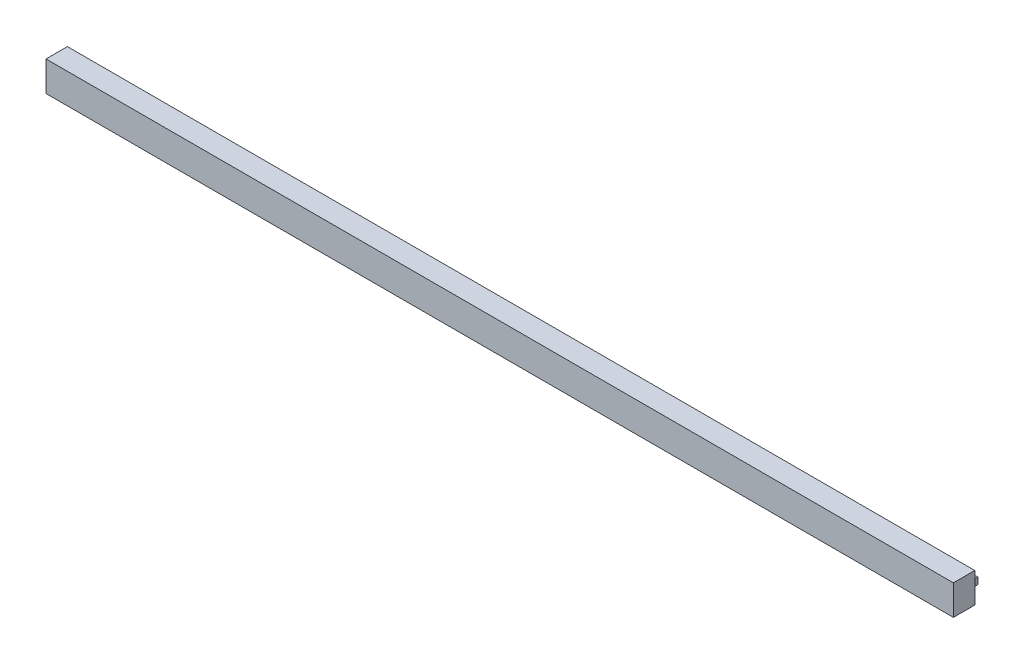
ISO-10303-21;
HEADER;
FILE_DESCRIPTION(('STEP AP214'),'2;1');
FILE_NAME('part.step','',(''),(''),'','','');
FILE_SCHEMA(('AUTOMOTIVE_DESIGN { 1 0 10303 214 1 1 1 1 }'));
ENDSEC;
DATA;
#1=APPLICATION_CONTEXT('core data for automotive mechanical design processes');
#2=APPLICATION_PROTOCOL_DEFINITION('international standard','automotive_design',2000,#1);
#3=PRODUCT_CONTEXT('',#1,'mechanical');
#4=PRODUCT('Part','Part','',(#3));
#5=PRODUCT_RELATED_PRODUCT_CATEGORY('part','',(#4));
#6=PRODUCT_DEFINITION_FORMATION('','',#4);
#7=PRODUCT_DEFINITION_CONTEXT('part definition',#1,'design');
#8=PRODUCT_DEFINITION('design','',#6,#7);
#9=PRODUCT_DEFINITION_SHAPE('','',#8);
#10=(LENGTH_UNIT() NAMED_UNIT(*) SI_UNIT(.MILLI.,.METRE.));
#11=(NAMED_UNIT(*) PLANE_ANGLE_UNIT() SI_UNIT($,.RADIAN.));
#12=(NAMED_UNIT(*) SI_UNIT($,.STERADIAN.) SOLID_ANGLE_UNIT());
#13=UNCERTAINTY_MEASURE_WITH_UNIT(LENGTH_MEASURE(1.E-05),#10,'distance_accuracy_value','');
#14=(GEOMETRIC_REPRESENTATION_CONTEXT(3) GLOBAL_UNCERTAINTY_ASSIGNED_CONTEXT((#13)) GLOBAL_UNIT_ASSIGNED_CONTEXT((#10,
#11,#12)) REPRESENTATION_CONTEXT('',''));
#15=CARTESIAN_POINT('',(0.,0.,0.));
#16=DIRECTION('',(0.,0.,1.));
#17=DIRECTION('',(1.,0.,0.));
#18=AXIS2_PLACEMENT_3D('',#15,#16,#17);
#19=CARTESIAN_POINT('',(0.,0.,5.));
#20=DIRECTION('',(1.,0.,0.));
#21=DIRECTION('',(0.,0.,-1.));
#22=AXIS2_PLACEMENT_3D('',#19,#20,#21);
#23=PLANE('',#22);
#24=DIRECTION('',(0.,-1.,0.));
#25=VECTOR('',#24,1.);
#26=CARTESIAN_POINT('',(0.,0.,0.));
#27=LINE('',#26,#25);
#28=CARTESIAN_POINT('',(0.,7.,0.));
#29=VERTEX_POINT('',#28);
#30=CARTESIAN_POINT('',(0.,0.,0.));
#31=VERTEX_POINT('',#30);
#32=EDGE_CURVE('E175',#29,#31,#27,.T.);
#33=ORIENTED_EDGE('',*,*,#32,.T.);
#34=DIRECTION('',(0.,0.,-1.));
#35=VECTOR('',#34,1.);
#36=CARTESIAN_POINT('',(0.,0.,5.));
#37=LINE('',#36,#35);
#38=CARTESIAN_POINT('',(0.,0.,5.));
#39=VERTEX_POINT('',#38);
#40=EDGE_CURVE('E11',#39,#31,#37,.T.);
#41=ORIENTED_EDGE('',*,*,#40,.F.);
#42=DIRECTION('',(0.,-1.,0.));
#43=VECTOR('',#42,1.);
#44=CARTESIAN_POINT('',(0.,0.,5.));
#45=LINE('',#44,#43);
#46=CARTESIAN_POINT('',(0.,7.,5.));
#47=VERTEX_POINT('',#46);
#48=EDGE_CURVE('E184',#47,#39,#45,.T.);
#49=ORIENTED_EDGE('',*,*,#48,.F.);
#50=DIRECTION('',(0.,0.,-1.));
#51=VECTOR('',#50,1.);
#52=CARTESIAN_POINT('',(0.,7.,5.));
#53=LINE('',#52,#51);
#54=EDGE_CURVE('E194',#47,#29,#53,.T.);
#55=ORIENTED_EDGE('',*,*,#54,.T.);
#56=EDGE_LOOP('',(#33,#41,#49,#55));
#57=FACE_BOUND('',#56,.T.);
#58=ADVANCED_FACE('F33',(#57),#23,.F.);
#59=CARTESIAN_POINT('',(0.,0.,5.));
#60=DIRECTION('',(0.,1.,0.));
#61=DIRECTION('',(0.,0.,1.));
#62=AXIS2_PLACEMENT_3D('',#59,#60,#61);
#63=PLANE('',#62);
#64=DIRECTION('',(1.,0.,0.));
#65=VECTOR('',#64,1.);
#66=CARTESIAN_POINT('',(0.,0.,0.));
#67=LINE('',#66,#65);
#68=CARTESIAN_POINT('',(212.,0.,0.));
#69=VERTEX_POINT('',#68);
#70=EDGE_CURVE('E197',#31,#69,#67,.T.);
#71=ORIENTED_EDGE('',*,*,#70,.T.);
#72=DIRECTION('',(0.,0.,-1.));
#73=VECTOR('',#72,1.);
#74=CARTESIAN_POINT('',(212.,0.,5.));
#75=LINE('',#74,#73);
#76=CARTESIAN_POINT('',(212.,0.,5.));
#77=VERTEX_POINT('',#76);
#78=EDGE_CURVE('E40',#77,#69,#75,.T.);
#79=ORIENTED_EDGE('',*,*,#78,.F.);
#80=DIRECTION('',(1.,0.,0.));
#81=VECTOR('',#80,1.);
#82=CARTESIAN_POINT('',(0.,0.,5.));
#83=LINE('',#82,#81);
#84=EDGE_CURVE('E187',#39,#77,#83,.T.);
#85=ORIENTED_EDGE('',*,*,#84,.F.);
#86=ORIENTED_EDGE('',*,*,#40,.T.);
#87=EDGE_LOOP('',(#71,#79,#85,#86));
#88=FACE_BOUND('',#87,.T.);
#89=ADVANCED_FACE('F226',(#88),#63,.F.);
#90=CARTESIAN_POINT('',(212.,0.,5.));
#91=DIRECTION('',(-1.,0.,0.));
#92=DIRECTION('',(0.,0.,1.));
#93=AXIS2_PLACEMENT_3D('',#90,#91,#92);
#94=PLANE('',#93);
#95=DIRECTION('',(0.,1.,0.));
#96=VECTOR('',#95,1.);
#97=CARTESIAN_POINT('',(212.,0.,0.));
#98=LINE('',#97,#96);
#99=CARTESIAN_POINT('',(212.,7.,0.));
#100=VERTEX_POINT('',#99);
#101=EDGE_CURVE('E199',#69,#100,#98,.T.);
#102=ORIENTED_EDGE('',*,*,#101,.T.);
#103=DIRECTION('',(0.,0.,-1.));
#104=VECTOR('',#103,1.);
#105=CARTESIAN_POINT('',(212.,7.,5.));
#106=LINE('',#105,#104);
#107=CARTESIAN_POINT('',(212.,7.,5.));
#108=VERTEX_POINT('',#107);
#109=EDGE_CURVE('E204',#108,#100,#106,.T.);
#110=ORIENTED_EDGE('',*,*,#109,.F.);
#111=DIRECTION('',(0.,1.,0.));
#112=VECTOR('',#111,1.);
#113=CARTESIAN_POINT('',(212.,0.,5.));
#114=LINE('',#113,#112);
#115=EDGE_CURVE('E190',#77,#108,#114,.T.);
#116=ORIENTED_EDGE('',*,*,#115,.F.);
#117=ORIENTED_EDGE('',*,*,#78,.T.);
#118=EDGE_LOOP('',(#102,#110,#116,#117));
#119=FACE_BOUND('',#118,.T.);
#120=ADVANCED_FACE('F211',(#119),#94,.F.);
#121=CARTESIAN_POINT('',(0.,7.,5.));
#122=DIRECTION('',(0.,-1.,0.));
#123=DIRECTION('',(0.,0.,-1.));
#124=AXIS2_PLACEMENT_3D('',#121,#122,#123);
#125=PLANE('',#124);
#126=DIRECTION('',(-1.,0.,0.));
#127=VECTOR('',#126,1.);
#128=CARTESIAN_POINT('',(0.,7.,0.));
#129=LINE('',#128,#127);
#130=EDGE_CURVE('E188',#100,#29,#129,.T.);
#131=ORIENTED_EDGE('',*,*,#130,.T.);
#132=ORIENTED_EDGE('',*,*,#54,.F.);
#133=DIRECTION('',(-1.,0.,0.));
#134=VECTOR('',#133,1.);
#135=CARTESIAN_POINT('',(0.,7.,5.));
#136=LINE('',#135,#134);
#137=EDGE_CURVE('E192',#108,#47,#136,.T.);
#138=ORIENTED_EDGE('',*,*,#137,.F.);
#139=ORIENTED_EDGE('',*,*,#109,.T.);
#140=EDGE_LOOP('',(#131,#132,#138,#139));
#141=FACE_BOUND('',#140,.T.);
#142=ADVANCED_FACE('F219',(#141),#125,.F.);
#143=CARTESIAN_POINT('',(0.,0.,5.));
#144=DIRECTION('',(0.,0.,-1.));
#145=DIRECTION('',(-1.,0.,0.));
#146=AXIS2_PLACEMENT_3D('',#143,#144,#145);
#147=PLANE('',#146);
#148=ORIENTED_EDGE('',*,*,#48,.T.);
#149=ORIENTED_EDGE('',*,*,#84,.T.);
#150=ORIENTED_EDGE('',*,*,#115,.T.);
#151=ORIENTED_EDGE('',*,*,#137,.T.);
#152=EDGE_LOOP('',(#148,#149,#150,#151));
#153=FACE_BOUND('',#152,.T.);
#154=ADVANCED_FACE('F225',(#153),#147,.F.);
#155=CARTESIAN_POINT('',(0.,0.,0.));
#156=DIRECTION('',(0.,0.,-1.));
#157=DIRECTION('',(-1.,0.,0.));
#158=AXIS2_PLACEMENT_3D('',#155,#156,#157);
#159=PLANE('',#158);
#160=DIRECTION('',(-1.,0.,0.));
#161=VECTOR('',#160,1.);
#162=CARTESIAN_POINT('',(3.25000000000003,3.51849413959701,0.));
#163=LINE('',#162,#161);
#164=CARTESIAN_POINT('',(3.25000000000003,3.51849413959701,0.));
#165=VERTEX_POINT('',#164);
#166=CARTESIAN_POINT('',(1.75000000000003,3.51849413959701,0.));
#167=VERTEX_POINT('',#166);
#168=EDGE_CURVE('E118',#165,#167,#163,.T.);
#169=ORIENTED_EDGE('',*,*,#168,.T.);
#170=DIRECTION('',(0.,-1.,0.));
#171=VECTOR('',#170,1.);
#172=CARTESIAN_POINT('',(1.75000000000003,3.51849413959701,0.));
#173=LINE('',#172,#171);
#174=CARTESIAN_POINT('',(1.75000000000003,2.01849413959701,0.));
#175=VERTEX_POINT('',#174);
#176=EDGE_CURVE('E123',#167,#175,#173,.T.);
#177=ORIENTED_EDGE('',*,*,#176,.T.);
#178=DIRECTION('',(1.,0.,0.));
#179=VECTOR('',#178,1.);
#180=CARTESIAN_POINT('',(1.75000000000003,2.01849413959701,0.));
#181=LINE('',#180,#179);
#182=CARTESIAN_POINT('',(3.25000000000003,2.01849413959701,0.));
#183=VERTEX_POINT('',#182);
#184=EDGE_CURVE('E52',#175,#183,#181,.T.);
#185=ORIENTED_EDGE('',*,*,#184,.T.);
#186=DIRECTION('',(0.,1.,0.));
#187=VECTOR('',#186,1.);
#188=CARTESIAN_POINT('',(3.25000000000003,2.01849413959701,0.));
#189=LINE('',#188,#187);
#190=EDGE_CURVE('E47',#183,#165,#189,.T.);
#191=ORIENTED_EDGE('',*,*,#190,.T.);
#192=EDGE_LOOP('',(#169,#177,#185,#191));
#193=FACE_BOUND('',#192,.T.);
#194=DIRECTION('',(-1.,0.,0.));
#195=VECTOR('',#194,1.);
#196=CARTESIAN_POINT('',(210.25,3.51849413959701,0.));
#197=LINE('',#196,#195);
#198=CARTESIAN_POINT('',(210.25,3.51849413959701,0.));
#199=VERTEX_POINT('',#198);
#200=CARTESIAN_POINT('',(208.75,3.51849413959701,0.));
#201=VERTEX_POINT('',#200);
#202=EDGE_CURVE('E126',#199,#201,#197,.T.);
#203=ORIENTED_EDGE('',*,*,#202,.T.);
#204=DIRECTION('',(0.,-1.,0.));
#205=VECTOR('',#204,1.);
#206=CARTESIAN_POINT('',(208.75,3.51849413959701,0.));
#207=LINE('',#206,#205);
#208=CARTESIAN_POINT('',(208.75,2.01849413959701,0.));
#209=VERTEX_POINT('',#208);
#210=EDGE_CURVE('E167',#201,#209,#207,.T.);
#211=ORIENTED_EDGE('',*,*,#210,.T.);
#212=DIRECTION('',(1.,0.,0.));
#213=VECTOR('',#212,1.);
#214=CARTESIAN_POINT('',(208.75,2.01849413959701,0.));
#215=LINE('',#214,#213);
#216=CARTESIAN_POINT('',(210.25,2.01849413959701,0.));
#217=VERTEX_POINT('',#216);
#218=EDGE_CURVE('E169',#209,#217,#215,.T.);
#219=ORIENTED_EDGE('',*,*,#218,.T.);
#220=DIRECTION('',(0.,1.,0.));
#221=VECTOR('',#220,1.);
#222=CARTESIAN_POINT('',(210.25,2.01849413959701,0.));
#223=LINE('',#222,#221);
#224=EDGE_CURVE('E156',#217,#199,#223,.T.);
#225=ORIENTED_EDGE('',*,*,#224,.T.);
#226=EDGE_LOOP('',(#203,#211,#219,#225));
#227=FACE_BOUND('',#226,.T.);
#228=ORIENTED_EDGE('',*,*,#32,.F.);
#229=ORIENTED_EDGE('',*,*,#130,.F.);
#230=ORIENTED_EDGE('',*,*,#101,.F.);
#231=ORIENTED_EDGE('',*,*,#70,.F.);
#232=EDGE_LOOP('',(#228,#229,#230,#231));
#233=FACE_BOUND('',#232,.T.);
#234=ADVANCED_FACE('F120',(#193,#227,#233),#159,.T.);
#235=CARTESIAN_POINT('',(210.25,3.51849413959701,-2.5));
#236=DIRECTION('',(0.,1.,0.));
#237=DIRECTION('',(0.,0.,1.));
#238=AXIS2_PLACEMENT_3D('',#235,#236,#237);
#239=PLANE('',#238);
#240=ORIENTED_EDGE('',*,*,#202,.F.);
#241=DIRECTION('',(0.,0.,1.));
#242=VECTOR('',#241,1.);
#243=CARTESIAN_POINT('',(210.25,3.51849413959701,-2.5));
#244=LINE('',#243,#242);
#245=CARTESIAN_POINT('',(210.25,3.51849413959701,-2.5));
#246=VERTEX_POINT('',#245);
#247=EDGE_CURVE('E172',#246,#199,#244,.T.);
#248=ORIENTED_EDGE('',*,*,#247,.F.);
#249=DIRECTION('',(-1.,0.,0.));
#250=VECTOR('',#249,1.);
#251=CARTESIAN_POINT('',(210.25,3.51849413959701,-2.5));
#252=LINE('',#251,#250);
#253=CARTESIAN_POINT('',(208.75,3.51849413959701,-2.5));
#254=VERTEX_POINT('',#253);
#255=EDGE_CURVE('E152',#246,#254,#252,.T.);
#256=ORIENTED_EDGE('',*,*,#255,.T.);
#257=DIRECTION('',(0.,0.,1.));
#258=VECTOR('',#257,1.);
#259=CARTESIAN_POINT('',(208.75,3.51849413959701,-2.5));
#260=LINE('',#259,#258);
#261=EDGE_CURVE('E165',#254,#201,#260,.T.);
#262=ORIENTED_EDGE('',*,*,#261,.T.);
#263=EDGE_LOOP('',(#240,#248,#256,#262));
#264=FACE_BOUND('',#263,.T.);
#265=ADVANCED_FACE('F238',(#264),#239,.T.);
#266=CARTESIAN_POINT('',(210.25,2.01849413959701,-2.5));
#267=DIRECTION('',(1.,0.,0.));
#268=DIRECTION('',(0.,0.,-1.));
#269=AXIS2_PLACEMENT_3D('',#266,#267,#268);
#270=PLANE('',#269);
#271=ORIENTED_EDGE('',*,*,#224,.F.);
#272=DIRECTION('',(0.,0.,1.));
#273=VECTOR('',#272,1.);
#274=CARTESIAN_POINT('',(210.25,2.01849413959701,-2.5));
#275=LINE('',#274,#273);
#276=CARTESIAN_POINT('',(210.25,2.01849413959701,-2.5));
#277=VERTEX_POINT('',#276);
#278=EDGE_CURVE('E176',#277,#217,#275,.T.);
#279=ORIENTED_EDGE('',*,*,#278,.F.);
#280=DIRECTION('',(0.,1.,0.));
#281=VECTOR('',#280,1.);
#282=CARTESIAN_POINT('',(210.25,2.01849413959701,-2.5));
#283=LINE('',#282,#281);
#284=EDGE_CURVE('E162',#277,#246,#283,.T.);
#285=ORIENTED_EDGE('',*,*,#284,.T.);
#286=ORIENTED_EDGE('',*,*,#247,.T.);
#287=EDGE_LOOP('',(#271,#279,#285,#286));
#288=FACE_BOUND('',#287,.T.);
#289=ADVANCED_FACE('F243',(#288),#270,.T.);
#290=CARTESIAN_POINT('',(208.75,2.01849413959701,-2.5));
#291=DIRECTION('',(0.,-1.,0.));
#292=DIRECTION('',(0.,0.,-1.));
#293=AXIS2_PLACEMENT_3D('',#290,#291,#292);
#294=PLANE('',#293);
#295=ORIENTED_EDGE('',*,*,#218,.F.);
#296=DIRECTION('',(0.,0.,1.));
#297=VECTOR('',#296,1.);
#298=CARTESIAN_POINT('',(208.75,2.01849413959701,-2.5));
#299=LINE('',#298,#297);
#300=CARTESIAN_POINT('',(208.75,2.01849413959701,-2.5));
#301=VERTEX_POINT('',#300);
#302=EDGE_CURVE('E179',#301,#209,#299,.T.);
#303=ORIENTED_EDGE('',*,*,#302,.F.);
#304=DIRECTION('',(1.,0.,0.));
#305=VECTOR('',#304,1.);
#306=CARTESIAN_POINT('',(208.75,2.01849413959701,-2.5));
#307=LINE('',#306,#305);
#308=EDGE_CURVE('E159',#301,#277,#307,.T.);
#309=ORIENTED_EDGE('',*,*,#308,.T.);
#310=ORIENTED_EDGE('',*,*,#278,.T.);
#311=EDGE_LOOP('',(#295,#303,#309,#310));
#312=FACE_BOUND('',#311,.T.);
#313=ADVANCED_FACE('F249',(#312),#294,.T.);
#314=CARTESIAN_POINT('',(208.75,3.51849413959701,-2.5));
#315=DIRECTION('',(-1.,0.,0.));
#316=DIRECTION('',(0.,0.,1.));
#317=AXIS2_PLACEMENT_3D('',#314,#315,#316);
#318=PLANE('',#317);
#319=ORIENTED_EDGE('',*,*,#210,.F.);
#320=ORIENTED_EDGE('',*,*,#261,.F.);
#321=DIRECTION('',(0.,-1.,0.));
#322=VECTOR('',#321,1.);
#323=CARTESIAN_POINT('',(208.75,3.51849413959701,-2.5));
#324=LINE('',#323,#322);
#325=EDGE_CURVE('E155',#254,#301,#324,.T.);
#326=ORIENTED_EDGE('',*,*,#325,.T.);
#327=ORIENTED_EDGE('',*,*,#302,.T.);
#328=EDGE_LOOP('',(#319,#320,#326,#327));
#329=FACE_BOUND('',#328,.T.);
#330=ADVANCED_FACE('F245',(#329),#318,.T.);
#331=CARTESIAN_POINT('',(0.,0.,-2.5));
#332=DIRECTION('',(0.,0.,1.));
#333=DIRECTION('',(1.,0.,0.));
#334=AXIS2_PLACEMENT_3D('',#331,#332,#333);
#335=PLANE('',#334);
#336=ORIENTED_EDGE('',*,*,#255,.F.);
#337=ORIENTED_EDGE('',*,*,#284,.F.);
#338=ORIENTED_EDGE('',*,*,#308,.F.);
#339=ORIENTED_EDGE('',*,*,#325,.F.);
#340=EDGE_LOOP('',(#336,#337,#338,#339));
#341=FACE_BOUND('',#340,.T.);
#342=ADVANCED_FACE('F248',(#341),#335,.F.);
#343=CARTESIAN_POINT('',(3.25000000000003,3.51849413959701,-2.5));
#344=DIRECTION('',(0.,1.,0.));
#345=DIRECTION('',(0.,0.,1.));
#346=AXIS2_PLACEMENT_3D('',#343,#344,#345);
#347=PLANE('',#346);
#348=ORIENTED_EDGE('',*,*,#168,.F.);
#349=DIRECTION('',(0.,0.,1.));
#350=VECTOR('',#349,1.);
#351=CARTESIAN_POINT('',(3.25000000000003,3.51849413959701,-2.5));
#352=LINE('',#351,#350);
#353=CARTESIAN_POINT('',(3.25000000000003,3.51849413959701,-2.5));
#354=VERTEX_POINT('',#353);
#355=EDGE_CURVE('E372',#354,#165,#352,.T.);
#356=ORIENTED_EDGE('',*,*,#355,.F.);
#357=DIRECTION('',(-1.,0.,0.));
#358=VECTOR('',#357,1.);
#359=CARTESIAN_POINT('',(3.25000000000003,3.51849413959701,-2.5));
#360=LINE('',#359,#358);
#361=CARTESIAN_POINT('',(1.75000000000003,3.51849413959701,-2.5));
#362=VERTEX_POINT('',#361);
#363=EDGE_CURVE('E132',#354,#362,#360,.T.);
#364=ORIENTED_EDGE('',*,*,#363,.T.);
#365=DIRECTION('',(0.,0.,1.));
#366=VECTOR('',#365,1.);
#367=CARTESIAN_POINT('',(1.75000000000003,3.51849413959701,-2.5));
#368=LINE('',#367,#366);
#369=EDGE_CURVE('E129',#362,#167,#368,.T.);
#370=ORIENTED_EDGE('',*,*,#369,.T.);
#371=EDGE_LOOP('',(#348,#356,#364,#370));
#372=FACE_BOUND('',#371,.T.);
#373=ADVANCED_FACE('F130',(#372),#347,.T.);
#374=CARTESIAN_POINT('',(3.25000000000003,2.01849413959701,-2.5));
#375=DIRECTION('',(1.,0.,0.));
#376=DIRECTION('',(0.,0.,-1.));
#377=AXIS2_PLACEMENT_3D('',#374,#375,#376);
#378=PLANE('',#377);
#379=ORIENTED_EDGE('',*,*,#190,.F.);
#380=DIRECTION('',(0.,0.,1.));
#381=VECTOR('',#380,1.);
#382=CARTESIAN_POINT('',(3.25000000000003,2.01849413959701,-2.5));
#383=LINE('',#382,#381);
#384=CARTESIAN_POINT('',(3.25000000000003,2.01849413959701,-2.5));
#385=VERTEX_POINT('',#384);
#386=EDGE_CURVE('E370',#385,#183,#383,.T.);
#387=ORIENTED_EDGE('',*,*,#386,.F.);
#388=DIRECTION('',(0.,1.,0.));
#389=VECTOR('',#388,1.);
#390=CARTESIAN_POINT('',(3.25000000000003,2.01849413959701,-2.5));
#391=LINE('',#390,#389);
#392=EDGE_CURVE('E136',#385,#354,#391,.T.);
#393=ORIENTED_EDGE('',*,*,#392,.T.);
#394=ORIENTED_EDGE('',*,*,#355,.T.);
#395=EDGE_LOOP('',(#379,#387,#393,#394));
#396=FACE_BOUND('',#395,.T.);
#397=ADVANCED_FACE('F264',(#396),#378,.T.);
#398=CARTESIAN_POINT('',(1.75000000000003,2.01849413959701,-2.5));
#399=DIRECTION('',(0.,-1.,0.));
#400=DIRECTION('',(0.,0.,-1.));
#401=AXIS2_PLACEMENT_3D('',#398,#399,#400);
#402=PLANE('',#401);
#403=ORIENTED_EDGE('',*,*,#184,.F.);
#404=DIRECTION('',(0.,0.,1.));
#405=VECTOR('',#404,1.);
#406=CARTESIAN_POINT('',(1.75000000000003,2.01849413959701,-2.5));
#407=LINE('',#406,#405);
#408=CARTESIAN_POINT('',(1.75000000000003,2.01849413959701,-2.5));
#409=VERTEX_POINT('',#408);
#410=EDGE_CURVE('E137',#409,#175,#407,.T.);
#411=ORIENTED_EDGE('',*,*,#410,.F.);
#412=DIRECTION('',(1.,0.,0.));
#413=VECTOR('',#412,1.);
#414=CARTESIAN_POINT('',(1.75000000000003,2.01849413959701,-2.5));
#415=LINE('',#414,#413);
#416=EDGE_CURVE('E146',#409,#385,#415,.T.);
#417=ORIENTED_EDGE('',*,*,#416,.T.);
#418=ORIENTED_EDGE('',*,*,#386,.T.);
#419=EDGE_LOOP('',(#403,#411,#417,#418));
#420=FACE_BOUND('',#419,.T.);
#421=ADVANCED_FACE('F267',(#420),#402,.T.);
#422=CARTESIAN_POINT('',(1.75000000000003,3.51849413959701,-2.5));
#423=DIRECTION('',(-1.,0.,0.));
#424=DIRECTION('',(0.,0.,1.));
#425=AXIS2_PLACEMENT_3D('',#422,#423,#424);
#426=PLANE('',#425);
#427=ORIENTED_EDGE('',*,*,#176,.F.);
#428=ORIENTED_EDGE('',*,*,#369,.F.);
#429=DIRECTION('',(0.,-1.,0.));
#430=VECTOR('',#429,1.);
#431=CARTESIAN_POINT('',(1.75000000000003,3.51849413959701,-2.5));
#432=LINE('',#431,#430);
#433=EDGE_CURVE('E149',#362,#409,#432,.T.);
#434=ORIENTED_EDGE('',*,*,#433,.T.);
#435=ORIENTED_EDGE('',*,*,#410,.T.);
#436=EDGE_LOOP('',(#427,#428,#434,#435));
#437=FACE_BOUND('',#436,.T.);
#438=ADVANCED_FACE('F139',(#437),#426,.T.);
#439=CARTESIAN_POINT('',(0.,0.,-2.5));
#440=DIRECTION('',(0.,0.,1.));
#441=DIRECTION('',(1.,0.,0.));
#442=AXIS2_PLACEMENT_3D('',#439,#440,#441);
#443=PLANE('',#442);
#444=ORIENTED_EDGE('',*,*,#363,.F.);
#445=ORIENTED_EDGE('',*,*,#392,.F.);
#446=ORIENTED_EDGE('',*,*,#416,.F.);
#447=ORIENTED_EDGE('',*,*,#433,.F.);
#448=EDGE_LOOP('',(#444,#445,#446,#447));
#449=FACE_BOUND('',#448,.T.);
#450=ADVANCED_FACE('F260',(#449),#443,.F.);
#451=CLOSED_SHELL('',(#58,#89,#120,#142,#154,#234,#265,#289,#313,#330,#342,#373,#397,#421,#438,#450));
#452=MANIFOLD_SOLID_BREP('B2',#451);
#453=ADVANCED_BREP_SHAPE_REPRESENTATION('',(#18,#452),#14);
#454=SHAPE_DEFINITION_REPRESENTATION(#9,#453);
ENDSEC;
END-ISO-10303-21;
